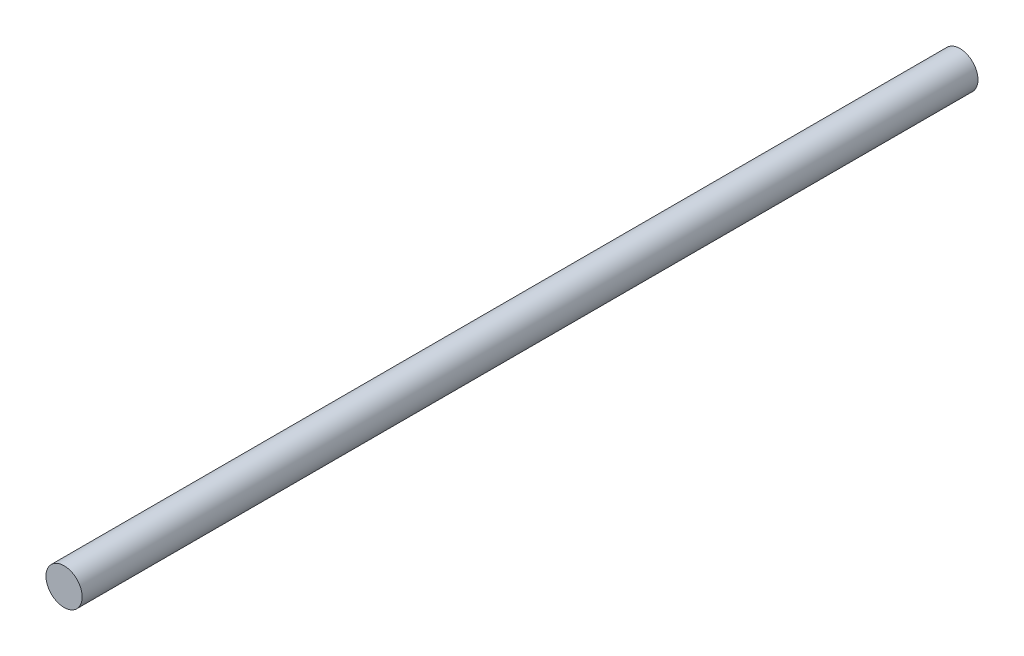
ISO-10303-21;
HEADER;
FILE_DESCRIPTION(('STEP AP214'),'2;1');
FILE_NAME('part.step','',(''),(''),'','','');
FILE_SCHEMA(('AUTOMOTIVE_DESIGN { 1 0 10303 214 1 1 1 1 }'));
ENDSEC;
DATA;
#1=APPLICATION_CONTEXT('core data for automotive mechanical design processes');
#2=APPLICATION_PROTOCOL_DEFINITION('international standard','automotive_design',2000,#1);
#3=PRODUCT_CONTEXT('',#1,'mechanical');
#4=PRODUCT('Part','Part','',(#3));
#5=PRODUCT_RELATED_PRODUCT_CATEGORY('part','',(#4));
#6=PRODUCT_DEFINITION_FORMATION('','',#4);
#7=PRODUCT_DEFINITION_CONTEXT('part definition',#1,'design');
#8=PRODUCT_DEFINITION('design','',#6,#7);
#9=PRODUCT_DEFINITION_SHAPE('','',#8);
#10=(LENGTH_UNIT() NAMED_UNIT(*) SI_UNIT(.MILLI.,.METRE.));
#11=(NAMED_UNIT(*) PLANE_ANGLE_UNIT() SI_UNIT($,.RADIAN.));
#12=(NAMED_UNIT(*) SI_UNIT($,.STERADIAN.) SOLID_ANGLE_UNIT());
#13=UNCERTAINTY_MEASURE_WITH_UNIT(LENGTH_MEASURE(1.E-05),#10,'distance_accuracy_value','');
#14=(GEOMETRIC_REPRESENTATION_CONTEXT(3) GLOBAL_UNCERTAINTY_ASSIGNED_CONTEXT((#13)) GLOBAL_UNIT_ASSIGNED_CONTEXT((#10,
#11,#12)) REPRESENTATION_CONTEXT('',''));
#15=CARTESIAN_POINT('',(0.,0.,0.));
#16=DIRECTION('',(0.,0.,1.));
#17=DIRECTION('',(1.,0.,0.));
#18=AXIS2_PLACEMENT_3D('',#15,#16,#17);
#19=CARTESIAN_POINT('',(0.,0.,198.));
#20=DIRECTION('',(0.,0.,-1.));
#21=DIRECTION('',(-1.,0.,0.));
#22=AXIS2_PLACEMENT_3D('',#19,#20,#21);
#23=CYLINDRICAL_SURFACE('',#22,4.);
#24=CARTESIAN_POINT('',(0.,0.,198.));
#25=DIRECTION('',(0.,0.,1.));
#26=DIRECTION('',(1.,0.,0.));
#27=AXIS2_PLACEMENT_3D('',#24,#25,#26);
#28=CIRCLE('',#27,4.);
#29=CARTESIAN_POINT('',(4.,0.,198.));
#30=VERTEX_POINT('',#29);
#31=EDGE_CURVE('E10',#30,#30,#28,.T.);
#32=ORIENTED_EDGE('',*,*,#31,.F.);
#33=EDGE_LOOP('',(#32));
#34=FACE_BOUND('',#33,.T.);
#35=CARTESIAN_POINT('',(0.,0.,0.));
#36=DIRECTION('',(0.,0.,1.));
#37=DIRECTION('',(1.,0.,0.));
#38=AXIS2_PLACEMENT_3D('',#35,#36,#37);
#39=CIRCLE('',#38,4.);
#40=CARTESIAN_POINT('',(4.,0.,0.));
#41=VERTEX_POINT('',#40);
#42=EDGE_CURVE('E38',#41,#41,#39,.T.);
#43=ORIENTED_EDGE('',*,*,#42,.T.);
#44=EDGE_LOOP('',(#43));
#45=FACE_BOUND('',#44,.T.);
#46=ADVANCED_FACE('F35',(#34,#45),#23,.T.);
#47=CARTESIAN_POINT('',(0.,0.,198.));
#48=DIRECTION('',(0.,0.,1.));
#49=DIRECTION('',(1.,0.,0.));
#50=AXIS2_PLACEMENT_3D('',#47,#48,#49);
#51=PLANE('',#50);
#52=ORIENTED_EDGE('',*,*,#31,.T.);
#53=EDGE_LOOP('',(#52));
#54=FACE_BOUND('',#53,.T.);
#55=ADVANCED_FACE('F50',(#54),#51,.T.);
#56=CARTESIAN_POINT('',(0.,0.,0.));
#57=DIRECTION('',(0.,0.,1.));
#58=DIRECTION('',(1.,0.,0.));
#59=AXIS2_PLACEMENT_3D('',#56,#57,#58);
#60=PLANE('',#59);
#61=ORIENTED_EDGE('',*,*,#42,.F.);
#62=EDGE_LOOP('',(#61));
#63=FACE_BOUND('',#62,.T.);
#64=ADVANCED_FACE('F48',(#63),#60,.F.);
#65=CLOSED_SHELL('',(#46,#55,#64));
#66=MANIFOLD_SOLID_BREP('B2',#65);
#67=ADVANCED_BREP_SHAPE_REPRESENTATION('',(#18,#66),#14);
#68=SHAPE_DEFINITION_REPRESENTATION(#9,#67);
ENDSEC;
END-ISO-10303-21;
